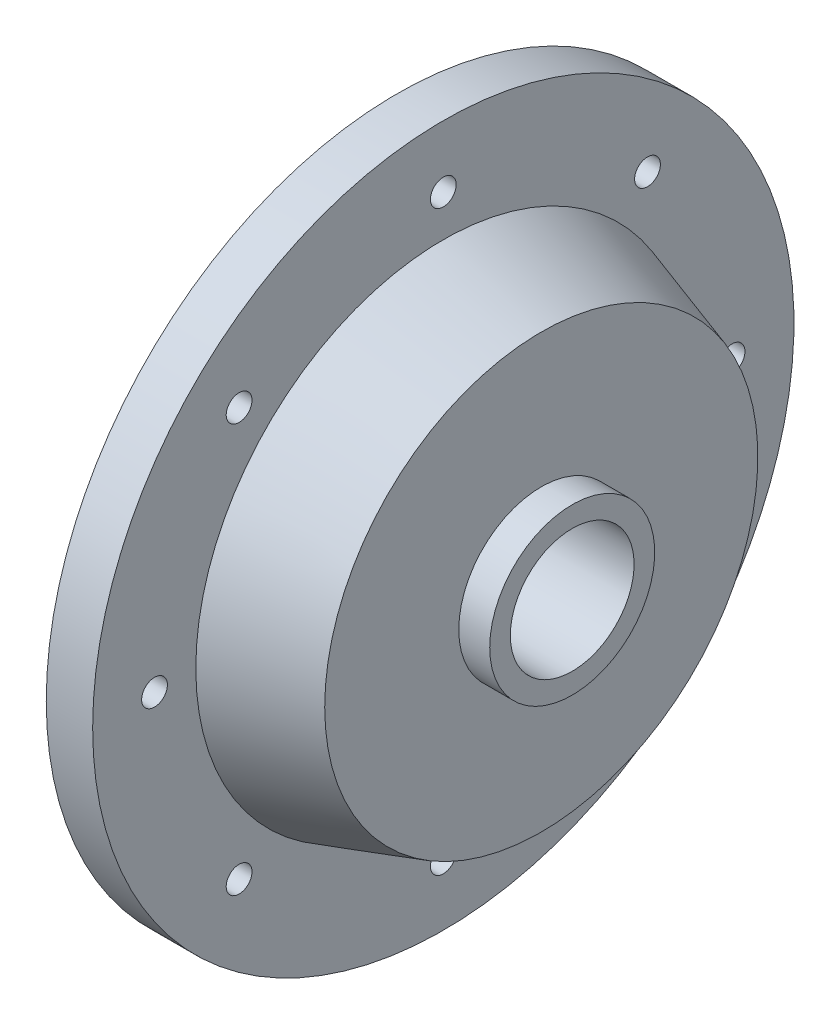
ISO-10303-21;
HEADER;
FILE_DESCRIPTION(('STEP AP214'),'2;1');
FILE_NAME('part.step','',(''),(''),'','','');
FILE_SCHEMA(('AUTOMOTIVE_DESIGN { 1 0 10303 214 1 1 1 1 }'));
ENDSEC;
DATA;
#1=APPLICATION_CONTEXT('core data for automotive mechanical design processes');
#2=APPLICATION_PROTOCOL_DEFINITION('international standard','automotive_design',2000,#1);
#3=PRODUCT_CONTEXT('',#1,'mechanical');
#4=PRODUCT('Part','Part','',(#3));
#5=PRODUCT_RELATED_PRODUCT_CATEGORY('part','',(#4));
#6=PRODUCT_DEFINITION_FORMATION('','',#4);
#7=PRODUCT_DEFINITION_CONTEXT('part definition',#1,'design');
#8=PRODUCT_DEFINITION('design','',#6,#7);
#9=PRODUCT_DEFINITION_SHAPE('','',#8);
#10=(LENGTH_UNIT() NAMED_UNIT(*) SI_UNIT(.MILLI.,.METRE.));
#11=(NAMED_UNIT(*) PLANE_ANGLE_UNIT() SI_UNIT($,.RADIAN.));
#12=(NAMED_UNIT(*) SI_UNIT($,.STERADIAN.) SOLID_ANGLE_UNIT());
#13=UNCERTAINTY_MEASURE_WITH_UNIT(LENGTH_MEASURE(1.E-05),#10,'distance_accuracy_value','');
#14=(GEOMETRIC_REPRESENTATION_CONTEXT(3) GLOBAL_UNCERTAINTY_ASSIGNED_CONTEXT((#13)) GLOBAL_UNIT_ASSIGNED_CONTEXT((#10,
#11,#12)) REPRESENTATION_CONTEXT('',''));
#15=CARTESIAN_POINT('',(0.,0.,0.));
#16=DIRECTION('',(0.,0.,1.));
#17=DIRECTION('',(1.,0.,0.));
#18=AXIS2_PLACEMENT_3D('',#15,#16,#17);
#19=CARTESIAN_POINT('',(5.00000000000001,16.,0.));
#20=DIRECTION('',(1.,0.,0.));
#21=DIRECTION('',(0.,0.,-1.));
#22=AXIS2_PLACEMENT_3D('',#19,#20,#21);
#23=PLANE('',#22);
#24=CARTESIAN_POINT('',(5.00000000000001,0.,0.));
#25=DIRECTION('',(-1.,0.,0.));
#26=DIRECTION('',(0.,0.,1.));
#27=AXIS2_PLACEMENT_3D('',#24,#25,#26);
#28=CIRCLE('',#27,12.);
#29=CARTESIAN_POINT('',(5.00000000000001,0.,12.));
#30=VERTEX_POINT('',#29);
#31=EDGE_CURVE('E10',#30,#30,#28,.T.);
#32=ORIENTED_EDGE('',*,*,#31,.F.);
#33=EDGE_LOOP('',(#32));
#34=FACE_BOUND('',#33,.T.);
#35=CARTESIAN_POINT('',(5.00000000000001,0.,0.));
#36=DIRECTION('',(-1.,0.,0.));
#37=DIRECTION('',(0.,0.,1.));
#38=AXIS2_PLACEMENT_3D('',#35,#36,#37);
#39=CIRCLE('',#38,16.);
#40=CARTESIAN_POINT('',(5.00000000000001,0.,16.));
#41=VERTEX_POINT('',#40);
#42=EDGE_CURVE('E76',#41,#41,#39,.T.);
#43=ORIENTED_EDGE('',*,*,#42,.T.);
#44=EDGE_LOOP('',(#43));
#45=FACE_BOUND('',#44,.T.);
#46=ADVANCED_FACE('F37',(#34,#45),#23,.F.);
#47=CARTESIAN_POINT('',(0.,0.,0.));
#48=DIRECTION('',(-1.,0.,0.));
#49=DIRECTION('',(0.,0.,1.));
#50=AXIS2_PLACEMENT_3D('',#47,#48,#49);
#51=CYLINDRICAL_SURFACE('',#50,12.);
#52=CARTESIAN_POINT('',(34.,0.,0.));
#53=DIRECTION('',(-1.,0.,0.));
#54=DIRECTION('',(0.,0.,1.));
#55=AXIS2_PLACEMENT_3D('',#52,#53,#54);
#56=CIRCLE('',#55,12.);
#57=CARTESIAN_POINT('',(34.,0.,12.));
#58=VERTEX_POINT('',#57);
#59=EDGE_CURVE('E44',#58,#58,#56,.T.);
#60=ORIENTED_EDGE('',*,*,#59,.F.);
#61=EDGE_LOOP('',(#60));
#62=FACE_BOUND('',#61,.T.);
#63=ORIENTED_EDGE('',*,*,#31,.T.);
#64=EDGE_LOOP('',(#63));
#65=FACE_BOUND('',#64,.T.);
#66=ADVANCED_FACE('F124',(#62,#65),#51,.F.);
#67=CARTESIAN_POINT('',(34.,12.,0.));
#68=DIRECTION('',(-1.,0.,0.));
#69=DIRECTION('',(0.,0.,1.));
#70=AXIS2_PLACEMENT_3D('',#67,#68,#69);
#71=PLANE('',#70);
#72=CARTESIAN_POINT('',(34.,0.,0.));
#73=DIRECTION('',(-1.,0.,0.));
#74=DIRECTION('',(0.,0.,1.));
#75=AXIS2_PLACEMENT_3D('',#72,#73,#74);
#76=CIRCLE('',#75,16.);
#77=CARTESIAN_POINT('',(34.,0.,16.));
#78=VERTEX_POINT('',#77);
#79=EDGE_CURVE('E49',#78,#78,#76,.T.);
#80=ORIENTED_EDGE('',*,*,#79,.F.);
#81=EDGE_LOOP('',(#80));
#82=FACE_BOUND('',#81,.T.);
#83=ORIENTED_EDGE('',*,*,#59,.T.);
#84=EDGE_LOOP('',(#83));
#85=FACE_BOUND('',#84,.T.);
#86=ADVANCED_FACE('F121',(#82,#85),#71,.F.);
#87=CARTESIAN_POINT('',(0.,0.,0.));
#88=DIRECTION('',(-1.,0.,0.));
#89=DIRECTION('',(0.,0.,1.));
#90=AXIS2_PLACEMENT_3D('',#87,#88,#89);
#91=CYLINDRICAL_SURFACE('',#90,16.);
#92=CARTESIAN_POINT('',(28.,0.,0.));
#93=DIRECTION('',(-1.,0.,0.));
#94=DIRECTION('',(0.,0.,1.));
#95=AXIS2_PLACEMENT_3D('',#92,#93,#94);
#96=CIRCLE('',#95,16.);
#97=CARTESIAN_POINT('',(28.,0.,16.));
#98=VERTEX_POINT('',#97);
#99=EDGE_CURVE('E114',#98,#98,#96,.T.);
#100=ORIENTED_EDGE('',*,*,#99,.F.);
#101=EDGE_LOOP('',(#100));
#102=FACE_BOUND('',#101,.T.);
#103=ORIENTED_EDGE('',*,*,#79,.T.);
#104=EDGE_LOOP('',(#103));
#105=FACE_BOUND('',#104,.T.);
#106=ADVANCED_FACE('F119',(#102,#105),#91,.T.);
#107=CARTESIAN_POINT('',(28.,16.,0.));
#108=DIRECTION('',(-1.,0.,0.));
#109=DIRECTION('',(0.,0.,1.));
#110=AXIS2_PLACEMENT_3D('',#107,#108,#109);
#111=PLANE('',#110);
#112=CARTESIAN_POINT('',(28.,0.,0.));
#113=DIRECTION('',(-1.,0.,0.));
#114=DIRECTION('',(0.,0.,1.));
#115=AXIS2_PLACEMENT_3D('',#112,#113,#114);
#116=CIRCLE('',#115,42.);
#117=CARTESIAN_POINT('',(28.,0.,42.));
#118=VERTEX_POINT('',#117);
#119=EDGE_CURVE('E111',#118,#118,#116,.T.);
#120=ORIENTED_EDGE('',*,*,#119,.F.);
#121=EDGE_LOOP('',(#120));
#122=FACE_BOUND('',#121,.T.);
#123=ORIENTED_EDGE('',*,*,#99,.T.);
#124=EDGE_LOOP('',(#123));
#125=FACE_BOUND('',#124,.T.);
#126=ADVANCED_FACE('F136',(#122,#125),#111,.F.);
#127=CARTESIAN_POINT('',(28.,0.,0.));
#128=DIRECTION('',(-1.,0.,0.));
#129=DIRECTION('',(0.,0.,1.));
#130=AXIS2_PLACEMENT_3D('',#127,#128,#129);
#131=CONICAL_SURFACE('',#130,42.,0.305878871404852);
#132=CARTESIAN_POINT('',(8.99999999999998,0.,0.));
#133=DIRECTION('',(-1.,0.,0.));
#134=DIRECTION('',(0.,0.,1.));
#135=AXIS2_PLACEMENT_3D('',#132,#133,#134);
#136=CIRCLE('',#135,48.);
#137=CARTESIAN_POINT('',(8.99999999999998,0.,48.));
#138=VERTEX_POINT('',#137);
#139=EDGE_CURVE('E108',#138,#138,#136,.T.);
#140=ORIENTED_EDGE('',*,*,#139,.F.);
#141=EDGE_LOOP('',(#140));
#142=FACE_BOUND('',#141,.T.);
#143=ORIENTED_EDGE('',*,*,#119,.T.);
#144=EDGE_LOOP('',(#143));
#145=FACE_BOUND('',#144,.T.);
#146=ADVANCED_FACE('F140',(#142,#145),#131,.T.);
#147=CARTESIAN_POINT('',(8.99999999999998,48.,0.));
#148=DIRECTION('',(-1.,0.,0.));
#149=DIRECTION('',(0.,0.,1.));
#150=AXIS2_PLACEMENT_3D('',#147,#148,#149);
#151=PLANE('',#150);
#152=CARTESIAN_POINT('',(8.99999999999998,56.,0.));
#153=DIRECTION('',(1.,0.,0.));
#154=DIRECTION('',(0.,0.,-1.));
#155=AXIS2_PLACEMENT_3D('',#152,#153,#154);
#156=CIRCLE('',#155,2.5);
#157=CARTESIAN_POINT('',(8.99999999999998,56.,-2.5));
#158=VERTEX_POINT('',#157);
#159=EDGE_CURVE('E57',#158,#158,#156,.T.);
#160=ORIENTED_EDGE('',*,*,#159,.F.);
#161=EDGE_LOOP('',(#160));
#162=FACE_BOUND('',#161,.T.);
#163=CARTESIAN_POINT('',(8.99999999999998,39.5979797464466,-39.5979797464467));
#164=DIRECTION('',(1.,0.,0.));
#165=DIRECTION('',(0.,0.,-1.));
#166=AXIS2_PLACEMENT_3D('',#163,#164,#165);
#167=CIRCLE('',#166,2.5);
#168=CARTESIAN_POINT('',(8.99999999999998,39.5979797464466,-42.0979797464467));
#169=VERTEX_POINT('',#168);
#170=EDGE_CURVE('E212',#169,#169,#167,.T.);
#171=ORIENTED_EDGE('',*,*,#170,.F.);
#172=EDGE_LOOP('',(#171));
#173=FACE_BOUND('',#172,.T.);
#174=CARTESIAN_POINT('',(8.99999999999998,-1.95522954975215E-13,-56.));
#175=DIRECTION('',(1.,0.,0.));
#176=DIRECTION('',(0.,0.,-1.));
#177=AXIS2_PLACEMENT_3D('',#174,#175,#176);
#178=CIRCLE('',#177,2.5);
#179=CARTESIAN_POINT('',(8.99999999999998,-1.95522954975215E-13,-58.5));
#180=VERTEX_POINT('',#179);
#181=EDGE_CURVE('E215',#180,#180,#178,.T.);
#182=ORIENTED_EDGE('',*,*,#181,.F.);
#183=EDGE_LOOP('',(#182));
#184=FACE_BOUND('',#183,.T.);
#185=CARTESIAN_POINT('',(8.99999999999998,-39.5979797464469,-39.5979797464464));
#186=DIRECTION('',(1.,0.,0.));
#187=DIRECTION('',(0.,0.,-1.));
#188=AXIS2_PLACEMENT_3D('',#185,#186,#187);
#189=CIRCLE('',#188,2.5);
#190=CARTESIAN_POINT('',(8.99999999999998,-39.5979797464469,-42.0979797464464));
#191=VERTEX_POINT('',#190);
#192=EDGE_CURVE('E220',#191,#191,#189,.T.);
#193=ORIENTED_EDGE('',*,*,#192,.F.);
#194=EDGE_LOOP('',(#193));
#195=FACE_BOUND('',#194,.T.);
#196=CARTESIAN_POINT('',(8.99999999999998,-56.,3.91045909950431E-13));
#197=DIRECTION('',(1.,0.,0.));
#198=DIRECTION('',(0.,0.,-1.));
#199=AXIS2_PLACEMENT_3D('',#196,#197,#198);
#200=CIRCLE('',#199,2.5);
#201=CARTESIAN_POINT('',(8.99999999999998,-56.,-2.49999999999961));
#202=VERTEX_POINT('',#201);
#203=EDGE_CURVE('E223',#202,#202,#200,.T.);
#204=ORIENTED_EDGE('',*,*,#203,.F.);
#205=EDGE_LOOP('',(#204));
#206=FACE_BOUND('',#205,.T.);
#207=CARTESIAN_POINT('',(8.99999999999998,-39.5979797464463,39.597979746447));
#208=DIRECTION('',(1.,0.,0.));
#209=DIRECTION('',(0.,0.,-1.));
#210=AXIS2_PLACEMENT_3D('',#207,#208,#209);
#211=CIRCLE('',#210,2.5);
#212=CARTESIAN_POINT('',(8.99999999999998,-39.5979797464463,37.097979746447));
#213=VERTEX_POINT('',#212);
#214=EDGE_CURVE('E226',#213,#213,#211,.T.);
#215=ORIENTED_EDGE('',*,*,#214,.F.);
#216=EDGE_LOOP('',(#215));
#217=FACE_BOUND('',#216,.T.);
#218=CARTESIAN_POINT('',(8.99999999999998,5.86568864925646E-13,56.));
#219=DIRECTION('',(1.,0.,0.));
#220=DIRECTION('',(0.,0.,-1.));
#221=AXIS2_PLACEMENT_3D('',#218,#219,#220);
#222=CIRCLE('',#221,2.5);
#223=CARTESIAN_POINT('',(8.99999999999998,5.86568864925646E-13,53.5));
#224=VERTEX_POINT('',#223);
#225=EDGE_CURVE('E228',#224,#224,#222,.T.);
#226=ORIENTED_EDGE('',*,*,#225,.F.);
#227=EDGE_LOOP('',(#226));
#228=FACE_BOUND('',#227,.T.);
#229=CARTESIAN_POINT('',(8.99999999999998,39.5979797464471,39.5979797464462));
#230=DIRECTION('',(1.,0.,0.));
#231=DIRECTION('',(0.,0.,-1.));
#232=AXIS2_PLACEMENT_3D('',#229,#230,#231);
#233=CIRCLE('',#232,2.5);
#234=CARTESIAN_POINT('',(8.99999999999998,39.5979797464471,37.0979797464462));
#235=VERTEX_POINT('',#234);
#236=EDGE_CURVE('E88',#235,#235,#233,.T.);
#237=ORIENTED_EDGE('',*,*,#236,.F.);
#238=EDGE_LOOP('',(#237));
#239=FACE_BOUND('',#238,.T.);
#240=CARTESIAN_POINT('',(8.99999999999998,0.,0.));
#241=DIRECTION('',(-1.,0.,0.));
#242=DIRECTION('',(0.,0.,1.));
#243=AXIS2_PLACEMENT_3D('',#240,#241,#242);
#244=CIRCLE('',#243,68.);
#245=CARTESIAN_POINT('',(8.99999999999998,0.,68.));
#246=VERTEX_POINT('',#245);
#247=EDGE_CURVE('E105',#246,#246,#244,.T.);
#248=ORIENTED_EDGE('',*,*,#247,.F.);
#249=EDGE_LOOP('',(#248));
#250=FACE_BOUND('',#249,.T.);
#251=ORIENTED_EDGE('',*,*,#139,.T.);
#252=EDGE_LOOP('',(#251));
#253=FACE_BOUND('',#252,.T.);
#254=ADVANCED_FACE('F144',(#162,#173,#184,#195,#206,#217,#228,#239,#250,#253),#151,.F.);
#255=CARTESIAN_POINT('',(0.,0.,0.));
#256=DIRECTION('',(-1.,0.,0.));
#257=DIRECTION('',(0.,0.,1.));
#258=AXIS2_PLACEMENT_3D('',#255,#256,#257);
#259=CYLINDRICAL_SURFACE('',#258,68.);
#260=CARTESIAN_POINT('',(0.,0.,0.));
#261=DIRECTION('',(-1.,0.,0.));
#262=DIRECTION('',(0.,0.,1.));
#263=AXIS2_PLACEMENT_3D('',#260,#261,#262);
#264=CIRCLE('',#263,68.);
#265=CARTESIAN_POINT('',(0.,0.,68.));
#266=VERTEX_POINT('',#265);
#267=EDGE_CURVE('E102',#266,#266,#264,.T.);
#268=ORIENTED_EDGE('',*,*,#267,.F.);
#269=EDGE_LOOP('',(#268));
#270=FACE_BOUND('',#269,.T.);
#271=ORIENTED_EDGE('',*,*,#247,.T.);
#272=EDGE_LOOP('',(#271));
#273=FACE_BOUND('',#272,.T.);
#274=ADVANCED_FACE('F148',(#270,#273),#259,.T.);
#275=CARTESIAN_POINT('',(0.,68.,0.));
#276=DIRECTION('',(1.,0.,0.));
#277=DIRECTION('',(0.,0.,-1.));
#278=AXIS2_PLACEMENT_3D('',#275,#276,#277);
#279=PLANE('',#278);
#280=CARTESIAN_POINT('',(0.,0.,0.));
#281=DIRECTION('',(-1.,0.,0.));
#282=DIRECTION('',(0.,0.,1.));
#283=AXIS2_PLACEMENT_3D('',#280,#281,#282);
#284=CIRCLE('',#283,64.);
#285=CARTESIAN_POINT('',(0.,0.,64.));
#286=VERTEX_POINT('',#285);
#287=EDGE_CURVE('E99',#286,#286,#284,.T.);
#288=ORIENTED_EDGE('',*,*,#287,.F.);
#289=EDGE_LOOP('',(#288));
#290=FACE_BOUND('',#289,.T.);
#291=ORIENTED_EDGE('',*,*,#267,.T.);
#292=EDGE_LOOP('',(#291));
#293=FACE_BOUND('',#292,.T.);
#294=ADVANCED_FACE('F152',(#290,#293),#279,.F.);
#295=CARTESIAN_POINT('',(0.,0.,0.));
#296=DIRECTION('',(-1.,0.,0.));
#297=DIRECTION('',(0.,0.,1.));
#298=AXIS2_PLACEMENT_3D('',#295,#296,#297);
#299=CYLINDRICAL_SURFACE('',#298,64.);
#300=CARTESIAN_POINT('',(5.,0.,0.));
#301=DIRECTION('',(-1.,0.,0.));
#302=DIRECTION('',(0.,0.,1.));
#303=AXIS2_PLACEMENT_3D('',#300,#301,#302);
#304=CIRCLE('',#303,64.);
#305=CARTESIAN_POINT('',(5.,0.,64.));
#306=VERTEX_POINT('',#305);
#307=EDGE_CURVE('E96',#306,#306,#304,.T.);
#308=ORIENTED_EDGE('',*,*,#307,.F.);
#309=EDGE_LOOP('',(#308));
#310=FACE_BOUND('',#309,.T.);
#311=ORIENTED_EDGE('',*,*,#287,.T.);
#312=EDGE_LOOP('',(#311));
#313=FACE_BOUND('',#312,.T.);
#314=ADVANCED_FACE('F156',(#310,#313),#299,.F.);
#315=CARTESIAN_POINT('',(5.,64.,0.));
#316=DIRECTION('',(1.,0.,0.));
#317=DIRECTION('',(0.,0.,-1.));
#318=AXIS2_PLACEMENT_3D('',#315,#316,#317);
#319=PLANE('',#318);
#320=CARTESIAN_POINT('',(5.,56.,0.));
#321=DIRECTION('',(1.,0.,0.));
#322=DIRECTION('',(0.,0.,-1.));
#323=AXIS2_PLACEMENT_3D('',#320,#321,#322);
#324=CIRCLE('',#323,2.5);
#325=CARTESIAN_POINT('',(5.,56.,-2.5));
#326=VERTEX_POINT('',#325);
#327=EDGE_CURVE('E40',#326,#326,#324,.T.);
#328=ORIENTED_EDGE('',*,*,#327,.T.);
#329=EDGE_LOOP('',(#328));
#330=FACE_BOUND('',#329,.T.);
#331=CARTESIAN_POINT('',(5.,39.5979797464466,-39.5979797464467));
#332=DIRECTION('',(1.,0.,0.));
#333=DIRECTION('',(0.,0.,-1.));
#334=AXIS2_PLACEMENT_3D('',#331,#332,#333);
#335=CIRCLE('',#334,2.5);
#336=CARTESIAN_POINT('',(5.,39.5979797464466,-42.0979797464467));
#337=VERTEX_POINT('',#336);
#338=EDGE_CURVE('E71',#337,#337,#335,.T.);
#339=ORIENTED_EDGE('',*,*,#338,.T.);
#340=EDGE_LOOP('',(#339));
#341=FACE_BOUND('',#340,.T.);
#342=CARTESIAN_POINT('',(5.,-1.95522954975215E-13,-56.));
#343=DIRECTION('',(1.,0.,0.));
#344=DIRECTION('',(0.,0.,-1.));
#345=AXIS2_PLACEMENT_3D('',#342,#343,#344);
#346=CIRCLE('',#345,2.5);
#347=CARTESIAN_POINT('',(5.,-1.95522954975215E-13,-58.5));
#348=VERTEX_POINT('',#347);
#349=EDGE_CURVE('E69',#348,#348,#346,.T.);
#350=ORIENTED_EDGE('',*,*,#349,.T.);
#351=EDGE_LOOP('',(#350));
#352=FACE_BOUND('',#351,.T.);
#353=CARTESIAN_POINT('',(5.,-39.5979797464469,-39.5979797464464));
#354=DIRECTION('',(1.,0.,0.));
#355=DIRECTION('',(0.,0.,-1.));
#356=AXIS2_PLACEMENT_3D('',#353,#354,#355);
#357=CIRCLE('',#356,2.5);
#358=CARTESIAN_POINT('',(5.,-39.5979797464469,-42.0979797464464));
#359=VERTEX_POINT('',#358);
#360=EDGE_CURVE('E66',#359,#359,#357,.T.);
#361=ORIENTED_EDGE('',*,*,#360,.T.);
#362=EDGE_LOOP('',(#361));
#363=FACE_BOUND('',#362,.T.);
#364=CARTESIAN_POINT('',(5.,-56.,3.91045909950431E-13));
#365=DIRECTION('',(1.,0.,0.));
#366=DIRECTION('',(0.,0.,-1.));
#367=AXIS2_PLACEMENT_3D('',#364,#365,#366);
#368=CIRCLE('',#367,2.5);
#369=CARTESIAN_POINT('',(5.,-56.,-2.49999999999961));
#370=VERTEX_POINT('',#369);
#371=EDGE_CURVE('E63',#370,#370,#368,.T.);
#372=ORIENTED_EDGE('',*,*,#371,.T.);
#373=EDGE_LOOP('',(#372));
#374=FACE_BOUND('',#373,.T.);
#375=CARTESIAN_POINT('',(5.,-39.5979797464463,39.597979746447));
#376=DIRECTION('',(1.,0.,0.));
#377=DIRECTION('',(0.,0.,-1.));
#378=AXIS2_PLACEMENT_3D('',#375,#376,#377);
#379=CIRCLE('',#378,2.5);
#380=CARTESIAN_POINT('',(5.,-39.5979797464463,37.097979746447));
#381=VERTEX_POINT('',#380);
#382=EDGE_CURVE('E60',#381,#381,#379,.T.);
#383=ORIENTED_EDGE('',*,*,#382,.T.);
#384=EDGE_LOOP('',(#383));
#385=FACE_BOUND('',#384,.T.);
#386=CARTESIAN_POINT('',(5.,5.86568864925646E-13,56.));
#387=DIRECTION('',(1.,0.,0.));
#388=DIRECTION('',(0.,0.,-1.));
#389=AXIS2_PLACEMENT_3D('',#386,#387,#388);
#390=CIRCLE('',#389,2.5);
#391=CARTESIAN_POINT('',(5.,5.86568864925646E-13,53.5));
#392=VERTEX_POINT('',#391);
#393=EDGE_CURVE('E56',#392,#392,#390,.T.);
#394=ORIENTED_EDGE('',*,*,#393,.T.);
#395=EDGE_LOOP('',(#394));
#396=FACE_BOUND('',#395,.T.);
#397=CARTESIAN_POINT('',(5.,39.5979797464471,39.5979797464462));
#398=DIRECTION('',(1.,0.,0.));
#399=DIRECTION('',(0.,0.,-1.));
#400=AXIS2_PLACEMENT_3D('',#397,#398,#399);
#401=CIRCLE('',#400,2.5);
#402=CARTESIAN_POINT('',(5.,39.5979797464471,37.0979797464462));
#403=VERTEX_POINT('',#402);
#404=EDGE_CURVE('E53',#403,#403,#401,.T.);
#405=ORIENTED_EDGE('',*,*,#404,.T.);
#406=EDGE_LOOP('',(#405));
#407=FACE_BOUND('',#406,.T.);
#408=CARTESIAN_POINT('',(5.,0.,0.));
#409=DIRECTION('',(-1.,0.,0.));
#410=DIRECTION('',(0.,0.,1.));
#411=AXIS2_PLACEMENT_3D('',#408,#409,#410);
#412=CIRCLE('',#411,40.);
#413=CARTESIAN_POINT('',(5.,0.,40.));
#414=VERTEX_POINT('',#413);
#415=EDGE_CURVE('E93',#414,#414,#412,.T.);
#416=ORIENTED_EDGE('',*,*,#415,.F.);
#417=EDGE_LOOP('',(#416));
#418=FACE_BOUND('',#417,.T.);
#419=ORIENTED_EDGE('',*,*,#307,.T.);
#420=EDGE_LOOP('',(#419));
#421=FACE_BOUND('',#420,.T.);
#422=ADVANCED_FACE('F160',(#330,#341,#352,#363,#374,#385,#396,#407,#418,#421),#319,.F.);
#423=CARTESIAN_POINT('',(0.,0.,0.));
#424=DIRECTION('',(-1.,0.,0.));
#425=DIRECTION('',(0.,0.,1.));
#426=AXIS2_PLACEMENT_3D('',#423,#424,#425);
#427=CYLINDRICAL_SURFACE('',#426,40.);
#428=CARTESIAN_POINT('',(20.,0.,0.));
#429=DIRECTION('',(-1.,0.,0.));
#430=DIRECTION('',(0.,0.,1.));
#431=AXIS2_PLACEMENT_3D('',#428,#429,#430);
#432=CIRCLE('',#431,40.);
#433=CARTESIAN_POINT('',(20.,0.,40.));
#434=VERTEX_POINT('',#433);
#435=EDGE_CURVE('E85',#434,#434,#432,.T.);
#436=ORIENTED_EDGE('',*,*,#435,.F.);
#437=EDGE_LOOP('',(#436));
#438=FACE_BOUND('',#437,.T.);
#439=ORIENTED_EDGE('',*,*,#415,.T.);
#440=EDGE_LOOP('',(#439));
#441=FACE_BOUND('',#440,.T.);
#442=ADVANCED_FACE('F164',(#438,#441),#427,.F.);
#443=CARTESIAN_POINT('',(20.,40.,0.));
#444=DIRECTION('',(1.,0.,0.));
#445=DIRECTION('',(0.,0.,-1.));
#446=AXIS2_PLACEMENT_3D('',#443,#444,#445);
#447=PLANE('',#446);
#448=CARTESIAN_POINT('',(20.,0.,0.));
#449=DIRECTION('',(-1.,0.,0.));
#450=DIRECTION('',(0.,0.,1.));
#451=AXIS2_PLACEMENT_3D('',#448,#449,#450);
#452=CIRCLE('',#451,16.);
#453=CARTESIAN_POINT('',(20.,0.,16.));
#454=VERTEX_POINT('',#453);
#455=EDGE_CURVE('E80',#454,#454,#452,.T.);
#456=ORIENTED_EDGE('',*,*,#455,.F.);
#457=EDGE_LOOP('',(#456));
#458=FACE_BOUND('',#457,.T.);
#459=ORIENTED_EDGE('',*,*,#435,.T.);
#460=EDGE_LOOP('',(#459));
#461=FACE_BOUND('',#460,.T.);
#462=ADVANCED_FACE('F167',(#458,#461),#447,.F.);
#463=CARTESIAN_POINT('',(0.,0.,0.));
#464=DIRECTION('',(-1.,0.,0.));
#465=DIRECTION('',(0.,0.,1.));
#466=AXIS2_PLACEMENT_3D('',#463,#464,#465);
#467=CYLINDRICAL_SURFACE('',#466,16.);
#468=ORIENTED_EDGE('',*,*,#42,.F.);
#469=EDGE_LOOP('',(#468));
#470=FACE_BOUND('',#469,.T.);
#471=ORIENTED_EDGE('',*,*,#455,.T.);
#472=EDGE_LOOP('',(#471));
#473=FACE_BOUND('',#472,.T.);
#474=ADVANCED_FACE('F171',(#470,#473),#467,.T.);
#475=CARTESIAN_POINT('',(0.,39.5979797464471,39.5979797464462));
#476=DIRECTION('',(1.,0.,0.));
#477=DIRECTION('',(0.,0.,-1.));
#478=AXIS2_PLACEMENT_3D('',#475,#476,#477);
#479=CYLINDRICAL_SURFACE('',#478,2.5);
#480=ORIENTED_EDGE('',*,*,#236,.T.);
#481=EDGE_LOOP('',(#480));
#482=FACE_BOUND('',#481,.T.);
#483=ORIENTED_EDGE('',*,*,#404,.F.);
#484=EDGE_LOOP('',(#483));
#485=FACE_BOUND('',#484,.T.);
#486=ADVANCED_FACE('F175',(#482,#485),#479,.F.);
#487=CARTESIAN_POINT('',(0.,5.86568864925646E-13,56.));
#488=DIRECTION('',(1.,0.,0.));
#489=DIRECTION('',(0.,0.,-1.));
#490=AXIS2_PLACEMENT_3D('',#487,#488,#489);
#491=CYLINDRICAL_SURFACE('',#490,2.5);
#492=ORIENTED_EDGE('',*,*,#225,.T.);
#493=EDGE_LOOP('',(#492));
#494=FACE_BOUND('',#493,.T.);
#495=ORIENTED_EDGE('',*,*,#393,.F.);
#496=EDGE_LOOP('',(#495));
#497=FACE_BOUND('',#496,.T.);
#498=ADVANCED_FACE('F179',(#494,#497),#491,.F.);
#499=CARTESIAN_POINT('',(0.,-39.5979797464463,39.597979746447));
#500=DIRECTION('',(1.,0.,0.));
#501=DIRECTION('',(0.,0.,-1.));
#502=AXIS2_PLACEMENT_3D('',#499,#500,#501);
#503=CYLINDRICAL_SURFACE('',#502,2.5);
#504=ORIENTED_EDGE('',*,*,#214,.T.);
#505=EDGE_LOOP('',(#504));
#506=FACE_BOUND('',#505,.T.);
#507=ORIENTED_EDGE('',*,*,#382,.F.);
#508=EDGE_LOOP('',(#507));
#509=FACE_BOUND('',#508,.T.);
#510=ADVANCED_FACE('F183',(#506,#509),#503,.F.);
#511=CARTESIAN_POINT('',(0.,-56.,3.91045909950431E-13));
#512=DIRECTION('',(1.,0.,0.));
#513=DIRECTION('',(0.,0.,-1.));
#514=AXIS2_PLACEMENT_3D('',#511,#512,#513);
#515=CYLINDRICAL_SURFACE('',#514,2.5);
#516=ORIENTED_EDGE('',*,*,#203,.T.);
#517=EDGE_LOOP('',(#516));
#518=FACE_BOUND('',#517,.T.);
#519=ORIENTED_EDGE('',*,*,#371,.F.);
#520=EDGE_LOOP('',(#519));
#521=FACE_BOUND('',#520,.T.);
#522=ADVANCED_FACE('F187',(#518,#521),#515,.F.);
#523=CARTESIAN_POINT('',(0.,-39.5979797464469,-39.5979797464464));
#524=DIRECTION('',(1.,0.,0.));
#525=DIRECTION('',(0.,0.,-1.));
#526=AXIS2_PLACEMENT_3D('',#523,#524,#525);
#527=CYLINDRICAL_SURFACE('',#526,2.5);
#528=ORIENTED_EDGE('',*,*,#192,.T.);
#529=EDGE_LOOP('',(#528));
#530=FACE_BOUND('',#529,.T.);
#531=ORIENTED_EDGE('',*,*,#360,.F.);
#532=EDGE_LOOP('',(#531));
#533=FACE_BOUND('',#532,.T.);
#534=ADVANCED_FACE('F191',(#530,#533),#527,.F.);
#535=CARTESIAN_POINT('',(0.,-1.95522954975215E-13,-56.));
#536=DIRECTION('',(1.,0.,0.));
#537=DIRECTION('',(0.,0.,-1.));
#538=AXIS2_PLACEMENT_3D('',#535,#536,#537);
#539=CYLINDRICAL_SURFACE('',#538,2.5);
#540=ORIENTED_EDGE('',*,*,#181,.T.);
#541=EDGE_LOOP('',(#540));
#542=FACE_BOUND('',#541,.T.);
#543=ORIENTED_EDGE('',*,*,#349,.F.);
#544=EDGE_LOOP('',(#543));
#545=FACE_BOUND('',#544,.T.);
#546=ADVANCED_FACE('F195',(#542,#545),#539,.F.);
#547=CARTESIAN_POINT('',(0.,39.5979797464466,-39.5979797464467));
#548=DIRECTION('',(1.,0.,0.));
#549=DIRECTION('',(0.,0.,-1.));
#550=AXIS2_PLACEMENT_3D('',#547,#548,#549);
#551=CYLINDRICAL_SURFACE('',#550,2.5);
#552=ORIENTED_EDGE('',*,*,#170,.T.);
#553=EDGE_LOOP('',(#552));
#554=FACE_BOUND('',#553,.T.);
#555=ORIENTED_EDGE('',*,*,#338,.F.);
#556=EDGE_LOOP('',(#555));
#557=FACE_BOUND('',#556,.T.);
#558=ADVANCED_FACE('F199',(#554,#557),#551,.F.);
#559=CARTESIAN_POINT('',(0.,56.,0.));
#560=DIRECTION('',(1.,0.,0.));
#561=DIRECTION('',(0.,0.,-1.));
#562=AXIS2_PLACEMENT_3D('',#559,#560,#561);
#563=CYLINDRICAL_SURFACE('',#562,2.5);
#564=ORIENTED_EDGE('',*,*,#159,.T.);
#565=EDGE_LOOP('',(#564));
#566=FACE_BOUND('',#565,.T.);
#567=ORIENTED_EDGE('',*,*,#327,.F.);
#568=EDGE_LOOP('',(#567));
#569=FACE_BOUND('',#568,.T.);
#570=ADVANCED_FACE('F203',(#566,#569),#563,.F.);
#571=CLOSED_SHELL('',(#46,#66,#86,#106,#126,#146,#254,#274,#294,#314,#422,#442,#462,#474,#486,
#498,#510,#522,#534,#546,#558,#570));
#572=MANIFOLD_SOLID_BREP('B2',#571);
#573=ADVANCED_BREP_SHAPE_REPRESENTATION('',(#18,#572),#14);
#574=SHAPE_DEFINITION_REPRESENTATION(#9,#573);
ENDSEC;
END-ISO-10303-21;
